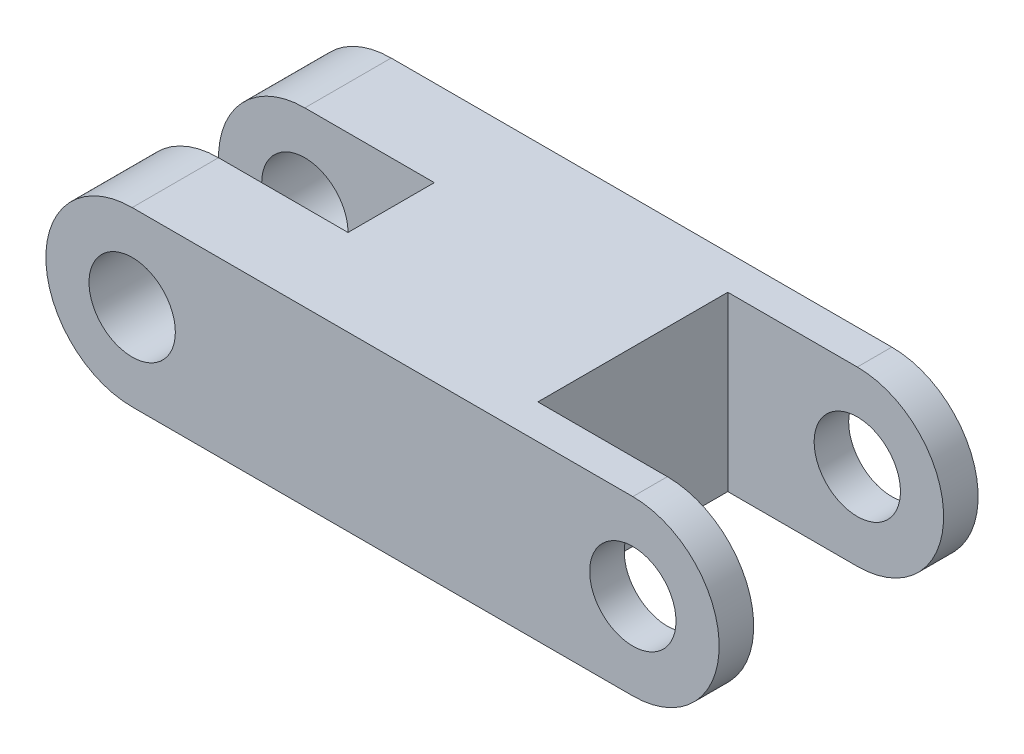
ISO-10303-21;
HEADER;
FILE_DESCRIPTION(('STEP AP214'),'2;1');
FILE_NAME('part.step','',(''),(''),'','','');
FILE_SCHEMA(('AUTOMOTIVE_DESIGN { 1 0 10303 214 1 1 1 1 }'));
ENDSEC;
DATA;
#1=APPLICATION_CONTEXT('core data for automotive mechanical design processes');
#2=APPLICATION_PROTOCOL_DEFINITION('international standard','automotive_design',2000,#1);
#3=PRODUCT_CONTEXT('',#1,'mechanical');
#4=PRODUCT('Part','Part','',(#3));
#5=PRODUCT_RELATED_PRODUCT_CATEGORY('part','',(#4));
#6=PRODUCT_DEFINITION_FORMATION('','',#4);
#7=PRODUCT_DEFINITION_CONTEXT('part definition',#1,'design');
#8=PRODUCT_DEFINITION('design','',#6,#7);
#9=PRODUCT_DEFINITION_SHAPE('','',#8);
#10=(LENGTH_UNIT() NAMED_UNIT(*) SI_UNIT(.MILLI.,.METRE.));
#11=(NAMED_UNIT(*) PLANE_ANGLE_UNIT() SI_UNIT($,.RADIAN.));
#12=(NAMED_UNIT(*) SI_UNIT($,.STERADIAN.) SOLID_ANGLE_UNIT());
#13=UNCERTAINTY_MEASURE_WITH_UNIT(LENGTH_MEASURE(1.E-05),#10,'distance_accuracy_value','');
#14=(GEOMETRIC_REPRESENTATION_CONTEXT(3) GLOBAL_UNCERTAINTY_ASSIGNED_CONTEXT((#13)) GLOBAL_UNIT_ASSIGNED_CONTEXT((#10,
#11,#12)) REPRESENTATION_CONTEXT('',''));
#15=CARTESIAN_POINT('',(0.,0.,0.));
#16=DIRECTION('',(0.,0.,1.));
#17=DIRECTION('',(1.,0.,0.));
#18=AXIS2_PLACEMENT_3D('',#15,#16,#17);
#19=CARTESIAN_POINT('',(0.,0.,30.));
#20=DIRECTION('',(0.,0.,-1.));
#21=DIRECTION('',(-1.,0.,0.));
#22=AXIS2_PLACEMENT_3D('',#19,#20,#21);
#23=CYLINDRICAL_SURFACE('',#22,10.);
#24=DIRECTION('',(0.,0.,-1.));
#25=VECTOR('',#24,1.);
#26=CARTESIAN_POINT('',(0.,10.,30.));
#27=LINE('',#26,#25);
#28=CARTESIAN_POINT('',(0.,10.,30.));
#29=VERTEX_POINT('',#28);
#30=CARTESIAN_POINT('',(0.,10.,20.));
#31=VERTEX_POINT('',#30);
#32=EDGE_CURVE('E217',#29,#31,#27,.T.);
#33=ORIENTED_EDGE('',*,*,#32,.T.);
#34=CARTESIAN_POINT('',(0.,0.,20.));
#35=DIRECTION('',(0.,0.,1.));
#36=DIRECTION('',(1.,0.,0.));
#37=AXIS2_PLACEMENT_3D('',#34,#35,#36);
#38=CIRCLE('',#37,10.);
#39=CARTESIAN_POINT('',(0.,-10.,20.));
#40=VERTEX_POINT('',#39);
#41=EDGE_CURVE('E181',#31,#40,#38,.T.);
#42=ORIENTED_EDGE('',*,*,#41,.T.);
#43=DIRECTION('',(0.,0.,-1.));
#44=VECTOR('',#43,1.);
#45=CARTESIAN_POINT('',(0.,-10.,30.));
#46=LINE('',#45,#44);
#47=CARTESIAN_POINT('',(0.,-10.,30.));
#48=VERTEX_POINT('',#47);
#49=EDGE_CURVE('E11',#48,#40,#46,.T.);
#50=ORIENTED_EDGE('',*,*,#49,.F.);
#51=CARTESIAN_POINT('',(0.,0.,30.));
#52=DIRECTION('',(0.,0.,1.));
#53=DIRECTION('',(1.,0.,0.));
#54=AXIS2_PLACEMENT_3D('',#51,#52,#53);
#55=CIRCLE('',#54,10.);
#56=EDGE_CURVE('E196',#29,#48,#55,.T.);
#57=ORIENTED_EDGE('',*,*,#56,.F.);
#58=EDGE_LOOP('',(#33,#42,#50,#57));
#59=FACE_BOUND('',#58,.T.);
#60=ADVANCED_FACE('F33',(#59),#23,.T.);
#61=CARTESIAN_POINT('',(57.9938700824609,0.,30.));
#62=DIRECTION('',(0.,0.,-1.));
#63=DIRECTION('',(-1.,0.,0.));
#64=AXIS2_PLACEMENT_3D('',#61,#62,#63);
#65=CYLINDRICAL_SURFACE('',#64,10.);
#66=DIRECTION('',(0.,0.,-1.));
#67=VECTOR('',#66,1.);
#68=CARTESIAN_POINT('',(57.9938700824609,10.,30.));
#69=LINE('',#68,#67);
#70=CARTESIAN_POINT('',(57.9938700824609,10.,4.));
#71=VERTEX_POINT('',#70);
#72=CARTESIAN_POINT('',(57.9938700824609,10.,0.));
#73=VERTEX_POINT('',#72);
#74=EDGE_CURVE('E220',#71,#73,#69,.T.);
#75=ORIENTED_EDGE('',*,*,#74,.F.);
#76=CARTESIAN_POINT('',(57.9938700824609,0.,4.));
#77=DIRECTION('',(0.,0.,-1.));
#78=DIRECTION('',(-1.,0.,0.));
#79=AXIS2_PLACEMENT_3D('',#76,#77,#78);
#80=CIRCLE('',#79,10.);
#81=CARTESIAN_POINT('',(57.9938700824609,-10.,4.));
#82=VERTEX_POINT('',#81);
#83=EDGE_CURVE('E177',#71,#82,#80,.T.);
#84=ORIENTED_EDGE('',*,*,#83,.T.);
#85=DIRECTION('',(0.,0.,-1.));
#86=VECTOR('',#85,1.);
#87=CARTESIAN_POINT('',(57.9938700824609,-10.,30.));
#88=LINE('',#87,#86);
#89=CARTESIAN_POINT('',(57.9938700824609,-10.,0.));
#90=VERTEX_POINT('',#89);
#91=EDGE_CURVE('E224',#82,#90,#88,.T.);
#92=ORIENTED_EDGE('',*,*,#91,.T.);
#93=CARTESIAN_POINT('',(57.9938700824609,0.,0.));
#94=DIRECTION('',(0.,0.,1.));
#95=DIRECTION('',(1.,0.,0.));
#96=AXIS2_PLACEMENT_3D('',#93,#94,#95);
#97=CIRCLE('',#96,10.);
#98=EDGE_CURVE('E212',#90,#73,#97,.T.);
#99=ORIENTED_EDGE('',*,*,#98,.T.);
#100=EDGE_LOOP('',(#75,#84,#92,#99));
#101=FACE_BOUND('',#100,.T.);
#102=ADVANCED_FACE('F262',(#101),#65,.T.);
#103=CARTESIAN_POINT('',(0.,0.,30.));
#104=DIRECTION('',(0.,0.,-1.));
#105=DIRECTION('',(-1.,0.,0.));
#106=AXIS2_PLACEMENT_3D('',#103,#104,#105);
#107=CYLINDRICAL_SURFACE('',#106,5.);
#108=CARTESIAN_POINT('',(0.,0.,20.));
#109=DIRECTION('',(0.,0.,1.));
#110=DIRECTION('',(1.,0.,0.));
#111=AXIS2_PLACEMENT_3D('',#108,#109,#110);
#112=CIRCLE('',#111,5.);
#113=CARTESIAN_POINT('',(5.,0.,20.));
#114=VERTEX_POINT('',#113);
#115=EDGE_CURVE('E37',#114,#114,#112,.T.);
#116=ORIENTED_EDGE('',*,*,#115,.F.);
#117=EDGE_LOOP('',(#116));
#118=FACE_BOUND('',#117,.T.);
#119=CARTESIAN_POINT('',(0.,0.,30.));
#120=DIRECTION('',(0.,0.,1.));
#121=DIRECTION('',(1.,0.,0.));
#122=AXIS2_PLACEMENT_3D('',#119,#120,#121);
#123=CIRCLE('',#122,5.);
#124=CARTESIAN_POINT('',(5.,0.,30.));
#125=VERTEX_POINT('',#124);
#126=EDGE_CURVE('E190',#125,#125,#123,.T.);
#127=ORIENTED_EDGE('',*,*,#126,.T.);
#128=EDGE_LOOP('',(#127));
#129=FACE_BOUND('',#128,.T.);
#130=ADVANCED_FACE('F241',(#118,#129),#107,.F.);
#131=CARTESIAN_POINT('',(57.9938700824609,0.,30.));
#132=DIRECTION('',(0.,0.,-1.));
#133=DIRECTION('',(-1.,0.,0.));
#134=AXIS2_PLACEMENT_3D('',#131,#132,#133);
#135=CYLINDRICAL_SURFACE('',#134,5.);
#136=CARTESIAN_POINT('',(57.9938700824609,0.,4.));
#137=DIRECTION('',(0.,0.,-1.));
#138=DIRECTION('',(-1.,0.,0.));
#139=AXIS2_PLACEMENT_3D('',#136,#137,#138);
#140=CIRCLE('',#139,5.);
#141=CARTESIAN_POINT('',(52.9938700824609,0.,4.));
#142=VERTEX_POINT('',#141);
#143=EDGE_CURVE('E176',#142,#142,#140,.T.);
#144=ORIENTED_EDGE('',*,*,#143,.F.);
#145=EDGE_LOOP('',(#144));
#146=FACE_BOUND('',#145,.T.);
#147=CARTESIAN_POINT('',(57.9938700824609,0.,0.));
#148=DIRECTION('',(0.,0.,1.));
#149=DIRECTION('',(1.,0.,0.));
#150=AXIS2_PLACEMENT_3D('',#147,#148,#149);
#151=CIRCLE('',#150,5.);
#152=CARTESIAN_POINT('',(62.9938700824609,0.,0.));
#153=VERTEX_POINT('',#152);
#154=EDGE_CURVE('E183',#153,#153,#151,.T.);
#155=ORIENTED_EDGE('',*,*,#154,.F.);
#156=EDGE_LOOP('',(#155));
#157=FACE_BOUND('',#156,.T.);
#158=ADVANCED_FACE('F252',(#146,#157),#135,.F.);
#159=CARTESIAN_POINT('',(0.,0.,30.));
#160=DIRECTION('',(0.,0.,1.));
#161=DIRECTION('',(1.,0.,0.));
#162=AXIS2_PLACEMENT_3D('',#159,#160,#161);
#163=PLANE('',#162);
#164=ORIENTED_EDGE('',*,*,#126,.F.);
#165=EDGE_LOOP('',(#164));
#166=FACE_BOUND('',#165,.T.);
#167=ORIENTED_EDGE('',*,*,#56,.T.);
#168=DIRECTION('',(1.,0.,0.));
#169=VECTOR('',#168,1.);
#170=CARTESIAN_POINT('',(0.,-10.,30.));
#171=LINE('',#170,#169);
#172=CARTESIAN_POINT('',(57.9938700824609,-10.,30.));
#173=VERTEX_POINT('',#172);
#174=EDGE_CURVE('E199',#48,#173,#171,.T.);
#175=ORIENTED_EDGE('',*,*,#174,.T.);
#176=CARTESIAN_POINT('',(57.9938700824609,0.,30.));
#177=DIRECTION('',(0.,0.,1.));
#178=DIRECTION('',(1.,0.,0.));
#179=AXIS2_PLACEMENT_3D('',#176,#177,#178);
#180=CIRCLE('',#179,10.);
#181=CARTESIAN_POINT('',(57.9938700824609,10.,30.));
#182=VERTEX_POINT('',#181);
#183=EDGE_CURVE('E202',#173,#182,#180,.T.);
#184=ORIENTED_EDGE('',*,*,#183,.T.);
#185=DIRECTION('',(-1.,0.,0.));
#186=VECTOR('',#185,1.);
#187=CARTESIAN_POINT('',(0.,10.,30.));
#188=LINE('',#187,#186);
#189=EDGE_CURVE('E204',#182,#29,#188,.T.);
#190=ORIENTED_EDGE('',*,*,#189,.T.);
#191=EDGE_LOOP('',(#167,#175,#184,#190));
#192=FACE_BOUND('',#191,.T.);
#193=CARTESIAN_POINT('',(57.9938700824609,0.,30.));
#194=DIRECTION('',(0.,0.,1.));
#195=DIRECTION('',(1.,0.,0.));
#196=AXIS2_PLACEMENT_3D('',#193,#194,#195);
#197=CIRCLE('',#196,5.);
#198=CARTESIAN_POINT('',(62.9938700824609,0.,30.));
#199=VERTEX_POINT('',#198);
#200=EDGE_CURVE('E184',#199,#199,#197,.T.);
#201=ORIENTED_EDGE('',*,*,#200,.F.);
#202=EDGE_LOOP('',(#201));
#203=FACE_BOUND('',#202,.T.);
#204=ADVANCED_FACE('F247',(#166,#192,#203),#163,.T.);
#205=CARTESIAN_POINT('',(0.,0.,0.));
#206=DIRECTION('',(0.,0.,1.));
#207=DIRECTION('',(1.,0.,0.));
#208=AXIS2_PLACEMENT_3D('',#205,#206,#207);
#209=PLANE('',#208);
#210=CARTESIAN_POINT('',(0.,0.,0.));
#211=DIRECTION('',(0.,0.,1.));
#212=DIRECTION('',(1.,0.,0.));
#213=AXIS2_PLACEMENT_3D('',#210,#211,#212);
#214=CIRCLE('',#213,10.);
#215=CARTESIAN_POINT('',(0.,10.,0.));
#216=VERTEX_POINT('',#215);
#217=CARTESIAN_POINT('',(0.,-10.,0.));
#218=VERTEX_POINT('',#217);
#219=EDGE_CURVE('E193',#216,#218,#214,.T.);
#220=ORIENTED_EDGE('',*,*,#219,.F.);
#221=DIRECTION('',(-1.,0.,0.));
#222=VECTOR('',#221,1.);
#223=CARTESIAN_POINT('',(0.,10.,0.));
#224=LINE('',#223,#222);
#225=EDGE_CURVE('E200',#73,#216,#224,.T.);
#226=ORIENTED_EDGE('',*,*,#225,.F.);
#227=ORIENTED_EDGE('',*,*,#98,.F.);
#228=DIRECTION('',(1.,0.,0.));
#229=VECTOR('',#228,1.);
#230=CARTESIAN_POINT('',(0.,-10.,0.));
#231=LINE('',#230,#229);
#232=EDGE_CURVE('E209',#218,#90,#231,.T.);
#233=ORIENTED_EDGE('',*,*,#232,.F.);
#234=EDGE_LOOP('',(#220,#226,#227,#233));
#235=FACE_BOUND('',#234,.T.);
#236=CARTESIAN_POINT('',(0.,0.,0.));
#237=DIRECTION('',(0.,0.,1.));
#238=DIRECTION('',(1.,0.,0.));
#239=AXIS2_PLACEMENT_3D('',#236,#237,#238);
#240=CIRCLE('',#239,5.);
#241=CARTESIAN_POINT('',(5.,0.,0.));
#242=VERTEX_POINT('',#241);
#243=EDGE_CURVE('E187',#242,#242,#240,.T.);
#244=ORIENTED_EDGE('',*,*,#243,.T.);
#245=EDGE_LOOP('',(#244));
#246=FACE_BOUND('',#245,.T.);
#247=ORIENTED_EDGE('',*,*,#154,.T.);
#248=EDGE_LOOP('',(#247));
#249=FACE_BOUND('',#248,.T.);
#250=ADVANCED_FACE('F244',(#235,#246,#249),#209,.F.);
#251=CARTESIAN_POINT('',(0.,0.,10.));
#252=DIRECTION('',(0.,0.,-1.));
#253=DIRECTION('',(-1.,0.,0.));
#254=AXIS2_PLACEMENT_3D('',#251,#252,#253);
#255=CIRCLE('',#254,10.);
#256=CARTESIAN_POINT('',(0.,-10.,10.));
#257=VERTEX_POINT('',#256);
#258=CARTESIAN_POINT('',(0.,10.,10.));
#259=VERTEX_POINT('',#258);
#260=EDGE_CURVE('E139',#257,#259,#255,.T.);
#261=ORIENTED_EDGE('',*,*,#260,.T.);
#262=EDGE_CURVE('E206',#259,#216,#27,.T.);
#263=ORIENTED_EDGE('',*,*,#262,.T.);
#264=ORIENTED_EDGE('',*,*,#219,.T.);
#265=EDGE_CURVE('E42',#257,#218,#46,.T.);
#266=ORIENTED_EDGE('',*,*,#265,.F.);
#267=EDGE_LOOP('',(#261,#263,#264,#266));
#268=FACE_BOUND('',#267,.T.);
#269=ADVANCED_FACE('F35',(#268),#23,.T.);
#270=CARTESIAN_POINT('',(0.,-10.,30.));
#271=DIRECTION('',(0.,1.,0.));
#272=DIRECTION('',(0.,0.,1.));
#273=AXIS2_PLACEMENT_3D('',#270,#271,#272);
#274=PLANE('',#273);
#275=ORIENTED_EDGE('',*,*,#49,.T.);
#276=DIRECTION('',(1.,0.,0.));
#277=VECTOR('',#276,1.);
#278=CARTESIAN_POINT('',(15.,-10.,20.));
#279=LINE('',#278,#277);
#280=CARTESIAN_POINT('',(15.,-10.,20.));
#281=VERTEX_POINT('',#280);
#282=EDGE_CURVE('E134',#40,#281,#279,.T.);
#283=ORIENTED_EDGE('',*,*,#282,.T.);
#284=DIRECTION('',(0.,0.,-1.));
#285=VECTOR('',#284,1.);
#286=CARTESIAN_POINT('',(15.,-10.,10.));
#287=LINE('',#286,#285);
#288=CARTESIAN_POINT('',(15.,-10.,10.));
#289=VERTEX_POINT('',#288);
#290=EDGE_CURVE('E128',#281,#289,#287,.T.);
#291=ORIENTED_EDGE('',*,*,#290,.T.);
#292=DIRECTION('',(-1.,0.,0.));
#293=VECTOR('',#292,1.);
#294=CARTESIAN_POINT('',(15.,-10.,10.));
#295=LINE('',#294,#293);
#296=EDGE_CURVE('E137',#289,#257,#295,.T.);
#297=ORIENTED_EDGE('',*,*,#296,.T.);
#298=ORIENTED_EDGE('',*,*,#265,.T.);
#299=ORIENTED_EDGE('',*,*,#232,.T.);
#300=ORIENTED_EDGE('',*,*,#91,.F.);
#301=DIRECTION('',(-1.,0.,0.));
#302=VECTOR('',#301,1.);
#303=CARTESIAN_POINT('',(42.9938700824609,-10.,4.));
#304=LINE('',#303,#302);
#305=CARTESIAN_POINT('',(42.9938700824609,-10.,4.));
#306=VERTEX_POINT('',#305);
#307=EDGE_CURVE('E163',#82,#306,#304,.T.);
#308=ORIENTED_EDGE('',*,*,#307,.T.);
#309=DIRECTION('',(0.,0.,1.));
#310=VECTOR('',#309,1.);
#311=CARTESIAN_POINT('',(42.9938700824609,-10.,26.));
#312=LINE('',#311,#310);
#313=CARTESIAN_POINT('',(42.9938700824609,-10.,26.));
#314=VERTEX_POINT('',#313);
#315=EDGE_CURVE('E156',#306,#314,#312,.T.);
#316=ORIENTED_EDGE('',*,*,#315,.T.);
#317=DIRECTION('',(1.,0.,0.));
#318=VECTOR('',#317,1.);
#319=CARTESIAN_POINT('',(42.9938700824609,-10.,26.));
#320=LINE('',#319,#318);
#321=CARTESIAN_POINT('',(57.9938700824609,-10.,26.));
#322=VERTEX_POINT('',#321);
#323=EDGE_CURVE('E159',#314,#322,#320,.T.);
#324=ORIENTED_EDGE('',*,*,#323,.T.);
#325=EDGE_CURVE('E225',#173,#322,#88,.T.);
#326=ORIENTED_EDGE('',*,*,#325,.F.);
#327=ORIENTED_EDGE('',*,*,#174,.F.);
#328=EDGE_LOOP('',(#275,#283,#291,#297,#298,#299,#300,#308,#316,#324,#326,#327));
#329=FACE_BOUND('',#328,.T.);
#330=ADVANCED_FACE('F143',(#329),#274,.F.);
#331=CARTESIAN_POINT('',(57.9938700824609,0.,26.));
#332=DIRECTION('',(0.,0.,1.));
#333=DIRECTION('',(1.,0.,0.));
#334=AXIS2_PLACEMENT_3D('',#331,#332,#333);
#335=CIRCLE('',#334,10.);
#336=CARTESIAN_POINT('',(57.9938700824609,10.,26.));
#337=VERTEX_POINT('',#336);
#338=EDGE_CURVE('E174',#322,#337,#335,.T.);
#339=ORIENTED_EDGE('',*,*,#338,.T.);
#340=EDGE_CURVE('E221',#182,#337,#69,.T.);
#341=ORIENTED_EDGE('',*,*,#340,.F.);
#342=ORIENTED_EDGE('',*,*,#183,.F.);
#343=ORIENTED_EDGE('',*,*,#325,.T.);
#344=EDGE_LOOP('',(#339,#341,#342,#343));
#345=FACE_BOUND('',#344,.T.);
#346=ADVANCED_FACE('F276',(#345),#65,.T.);
#347=CARTESIAN_POINT('',(0.,10.,30.));
#348=DIRECTION('',(0.,-1.,0.));
#349=DIRECTION('',(0.,0.,-1.));
#350=AXIS2_PLACEMENT_3D('',#347,#348,#349);
#351=PLANE('',#350);
#352=DIRECTION('',(0.,0.,-1.));
#353=VECTOR('',#352,1.);
#354=CARTESIAN_POINT('',(15.,10.,10.));
#355=LINE('',#354,#353);
#356=CARTESIAN_POINT('',(15.,10.,20.));
#357=VERTEX_POINT('',#356);
#358=CARTESIAN_POINT('',(15.,10.,10.));
#359=VERTEX_POINT('',#358);
#360=EDGE_CURVE('E50',#357,#359,#355,.T.);
#361=ORIENTED_EDGE('',*,*,#360,.F.);
#362=DIRECTION('',(1.,0.,0.));
#363=VECTOR('',#362,1.);
#364=CARTESIAN_POINT('',(15.,10.,20.));
#365=LINE('',#364,#363);
#366=EDGE_CURVE('E145',#31,#357,#365,.T.);
#367=ORIENTED_EDGE('',*,*,#366,.F.);
#368=ORIENTED_EDGE('',*,*,#32,.F.);
#369=ORIENTED_EDGE('',*,*,#189,.F.);
#370=ORIENTED_EDGE('',*,*,#340,.T.);
#371=DIRECTION('',(1.,0.,0.));
#372=VECTOR('',#371,1.);
#373=CARTESIAN_POINT('',(42.9938700824609,10.,26.));
#374=LINE('',#373,#372);
#375=CARTESIAN_POINT('',(42.9938700824609,10.,26.));
#376=VERTEX_POINT('',#375);
#377=EDGE_CURVE('E168',#376,#337,#374,.T.);
#378=ORIENTED_EDGE('',*,*,#377,.F.);
#379=DIRECTION('',(0.,0.,1.));
#380=VECTOR('',#379,1.);
#381=CARTESIAN_POINT('',(42.9938700824609,10.,26.));
#382=LINE('',#381,#380);
#383=CARTESIAN_POINT('',(42.9938700824609,10.,4.));
#384=VERTEX_POINT('',#383);
#385=EDGE_CURVE('E58',#384,#376,#382,.T.);
#386=ORIENTED_EDGE('',*,*,#385,.F.);
#387=DIRECTION('',(-1.,0.,0.));
#388=VECTOR('',#387,1.);
#389=CARTESIAN_POINT('',(42.9938700824609,10.,4.));
#390=LINE('',#389,#388);
#391=EDGE_CURVE('E160',#71,#384,#390,.T.);
#392=ORIENTED_EDGE('',*,*,#391,.F.);
#393=ORIENTED_EDGE('',*,*,#74,.T.);
#394=ORIENTED_EDGE('',*,*,#225,.T.);
#395=ORIENTED_EDGE('',*,*,#262,.F.);
#396=DIRECTION('',(-1.,0.,0.));
#397=VECTOR('',#396,1.);
#398=CARTESIAN_POINT('',(15.,10.,10.));
#399=LINE('',#398,#397);
#400=EDGE_CURVE('E147',#359,#259,#399,.T.);
#401=ORIENTED_EDGE('',*,*,#400,.F.);
#402=EDGE_LOOP('',(#361,#367,#368,#369,#370,#378,#386,#392,#393,#394,#395,#401));
#403=FACE_BOUND('',#402,.T.);
#404=ADVANCED_FACE('F239',(#403),#351,.F.);
#405=CARTESIAN_POINT('',(0.,0.,10.));
#406=DIRECTION('',(0.,0.,-1.));
#407=DIRECTION('',(-1.,0.,0.));
#408=AXIS2_PLACEMENT_3D('',#405,#406,#407);
#409=CIRCLE('',#408,5.);
#410=CARTESIAN_POINT('',(-5.,0.,10.));
#411=VERTEX_POINT('',#410);
#412=EDGE_CURVE('E179',#411,#411,#409,.T.);
#413=ORIENTED_EDGE('',*,*,#412,.F.);
#414=EDGE_LOOP('',(#413));
#415=FACE_BOUND('',#414,.T.);
#416=ORIENTED_EDGE('',*,*,#243,.F.);
#417=EDGE_LOOP('',(#416));
#418=FACE_BOUND('',#417,.T.);
#419=ADVANCED_FACE('F235',(#415,#418),#107,.F.);
#420=CARTESIAN_POINT('',(57.9938700824609,0.,26.));
#421=DIRECTION('',(0.,0.,1.));
#422=DIRECTION('',(1.,0.,0.));
#423=AXIS2_PLACEMENT_3D('',#420,#421,#422);
#424=CIRCLE('',#423,5.);
#425=CARTESIAN_POINT('',(62.9938700824609,0.,26.));
#426=VERTEX_POINT('',#425);
#427=EDGE_CURVE('E154',#426,#426,#424,.T.);
#428=ORIENTED_EDGE('',*,*,#427,.F.);
#429=EDGE_LOOP('',(#428));
#430=FACE_BOUND('',#429,.T.);
#431=ORIENTED_EDGE('',*,*,#200,.T.);
#432=EDGE_LOOP('',(#431));
#433=FACE_BOUND('',#432,.T.);
#434=ADVANCED_FACE('F238',(#430,#433),#135,.F.);
#435=CARTESIAN_POINT('',(42.9938700824609,-10.,4.));
#436=DIRECTION('',(0.,0.,-1.));
#437=DIRECTION('',(-1.,0.,0.));
#438=AXIS2_PLACEMENT_3D('',#435,#436,#437);
#439=PLANE('',#438);
#440=ORIENTED_EDGE('',*,*,#143,.T.);
#441=EDGE_LOOP('',(#440));
#442=FACE_BOUND('',#441,.T.);
#443=ORIENTED_EDGE('',*,*,#391,.T.);
#444=DIRECTION('',(0.,1.,0.));
#445=VECTOR('',#444,1.);
#446=CARTESIAN_POINT('',(42.9938700824609,-10.,4.));
#447=LINE('',#446,#445);
#448=EDGE_CURVE('E152',#306,#384,#447,.T.);
#449=ORIENTED_EDGE('',*,*,#448,.F.);
#450=ORIENTED_EDGE('',*,*,#307,.F.);
#451=ORIENTED_EDGE('',*,*,#83,.F.);
#452=EDGE_LOOP('',(#443,#449,#450,#451));
#453=FACE_BOUND('',#452,.T.);
#454=ADVANCED_FACE('F267',(#442,#453),#439,.F.);
#455=CARTESIAN_POINT('',(42.9938700824609,-10.,26.));
#456=DIRECTION('',(0.,0.,1.));
#457=DIRECTION('',(1.,0.,0.));
#458=AXIS2_PLACEMENT_3D('',#455,#456,#457);
#459=PLANE('',#458);
#460=ORIENTED_EDGE('',*,*,#427,.T.);
#461=EDGE_LOOP('',(#460));
#462=FACE_BOUND('',#461,.T.);
#463=ORIENTED_EDGE('',*,*,#338,.F.);
#464=ORIENTED_EDGE('',*,*,#323,.F.);
#465=DIRECTION('',(0.,1.,0.));
#466=VECTOR('',#465,1.);
#467=CARTESIAN_POINT('',(42.9938700824609,-10.,26.));
#468=LINE('',#467,#466);
#469=EDGE_CURVE('E166',#314,#376,#468,.T.);
#470=ORIENTED_EDGE('',*,*,#469,.T.);
#471=ORIENTED_EDGE('',*,*,#377,.T.);
#472=EDGE_LOOP('',(#463,#464,#470,#471));
#473=FACE_BOUND('',#472,.T.);
#474=ADVANCED_FACE('F311',(#462,#473),#459,.F.);
#475=CARTESIAN_POINT('',(42.9938700824609,-10.,26.));
#476=DIRECTION('',(-1.,0.,0.));
#477=DIRECTION('',(0.,0.,1.));
#478=AXIS2_PLACEMENT_3D('',#475,#476,#477);
#479=PLANE('',#478);
#480=ORIENTED_EDGE('',*,*,#385,.T.);
#481=ORIENTED_EDGE('',*,*,#469,.F.);
#482=ORIENTED_EDGE('',*,*,#315,.F.);
#483=ORIENTED_EDGE('',*,*,#448,.T.);
#484=EDGE_LOOP('',(#480,#481,#482,#483));
#485=FACE_BOUND('',#484,.T.);
#486=ADVANCED_FACE('F294',(#485),#479,.F.);
#487=CARTESIAN_POINT('',(15.,-10.,20.));
#488=DIRECTION('',(0.,0.,1.));
#489=DIRECTION('',(1.,0.,0.));
#490=AXIS2_PLACEMENT_3D('',#487,#488,#489);
#491=PLANE('',#490);
#492=ORIENTED_EDGE('',*,*,#115,.T.);
#493=EDGE_LOOP('',(#492));
#494=FACE_BOUND('',#493,.T.);
#495=ORIENTED_EDGE('',*,*,#366,.T.);
#496=DIRECTION('',(0.,1.,0.));
#497=VECTOR('',#496,1.);
#498=CARTESIAN_POINT('',(15.,-10.,20.));
#499=LINE('',#498,#497);
#500=EDGE_CURVE('E133',#281,#357,#499,.T.);
#501=ORIENTED_EDGE('',*,*,#500,.F.);
#502=ORIENTED_EDGE('',*,*,#282,.F.);
#503=ORIENTED_EDGE('',*,*,#41,.F.);
#504=EDGE_LOOP('',(#495,#501,#502,#503));
#505=FACE_BOUND('',#504,.T.);
#506=ADVANCED_FACE('F309',(#494,#505),#491,.F.);
#507=CARTESIAN_POINT('',(15.,-10.,10.));
#508=DIRECTION('',(0.,0.,-1.));
#509=DIRECTION('',(-1.,0.,0.));
#510=AXIS2_PLACEMENT_3D('',#507,#508,#509);
#511=PLANE('',#510);
#512=ORIENTED_EDGE('',*,*,#412,.T.);
#513=EDGE_LOOP('',(#512));
#514=FACE_BOUND('',#513,.T.);
#515=ORIENTED_EDGE('',*,*,#260,.F.);
#516=ORIENTED_EDGE('',*,*,#296,.F.);
#517=DIRECTION('',(0.,1.,0.));
#518=VECTOR('',#517,1.);
#519=CARTESIAN_POINT('',(15.,-10.,10.));
#520=LINE('',#519,#518);
#521=EDGE_CURVE('E124',#289,#359,#520,.T.);
#522=ORIENTED_EDGE('',*,*,#521,.T.);
#523=ORIENTED_EDGE('',*,*,#400,.T.);
#524=EDGE_LOOP('',(#515,#516,#522,#523));
#525=FACE_BOUND('',#524,.T.);
#526=ADVANCED_FACE('F138',(#514,#525),#511,.F.);
#527=CARTESIAN_POINT('',(15.,-10.,10.));
#528=DIRECTION('',(1.,0.,0.));
#529=DIRECTION('',(0.,0.,-1.));
#530=AXIS2_PLACEMENT_3D('',#527,#528,#529);
#531=PLANE('',#530);
#532=ORIENTED_EDGE('',*,*,#360,.T.);
#533=ORIENTED_EDGE('',*,*,#521,.F.);
#534=ORIENTED_EDGE('',*,*,#290,.F.);
#535=ORIENTED_EDGE('',*,*,#500,.T.);
#536=EDGE_LOOP('',(#532,#533,#534,#535));
#537=FACE_BOUND('',#536,.T.);
#538=ADVANCED_FACE('F126',(#537),#531,.F.);
#539=CLOSED_SHELL('',(#60,#102,#130,#158,#204,#250,#269,#330,#346,#404,#419,#434,#454,#474,#486,
#506,#526,#538));
#540=MANIFOLD_SOLID_BREP('B2',#539);
#541=ADVANCED_BREP_SHAPE_REPRESENTATION('',(#18,#540),#14);
#542=SHAPE_DEFINITION_REPRESENTATION(#9,#541);
ENDSEC;
END-ISO-10303-21;
